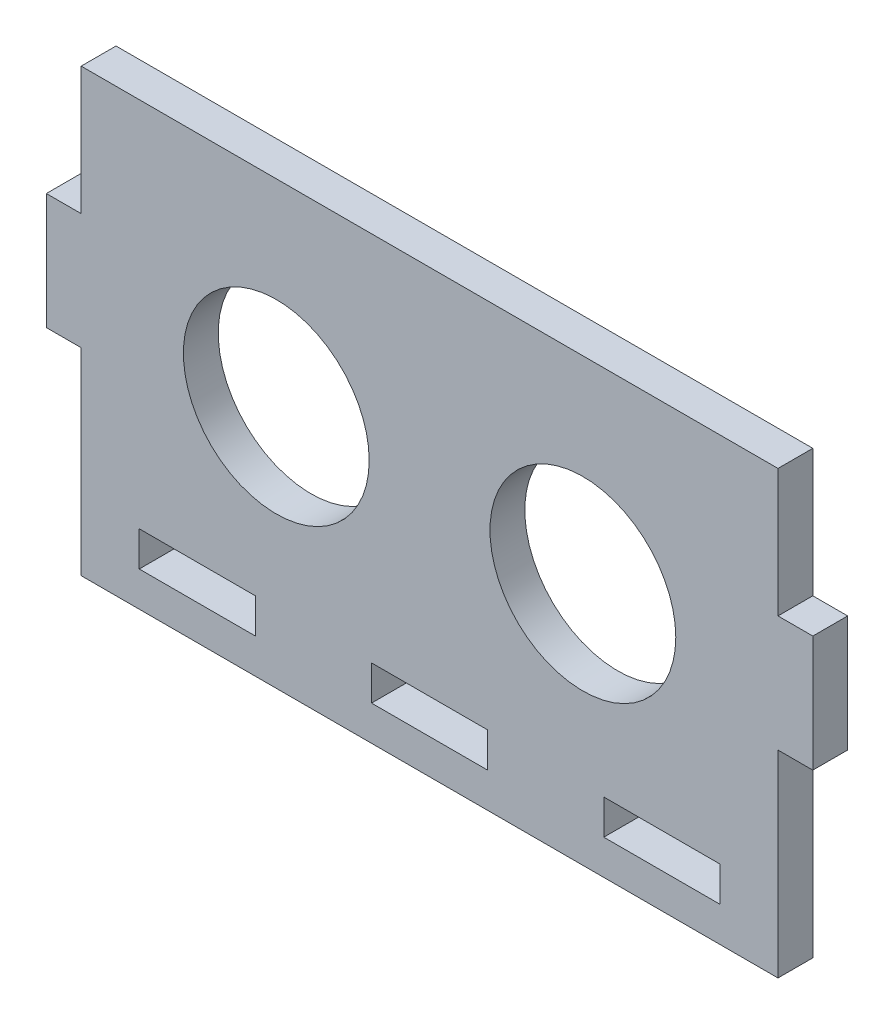
ISO-10303-21;
HEADER;
FILE_DESCRIPTION(('STEP AP214'),'2;1');
FILE_NAME('part.step','',(''),(''),'','','');
FILE_SCHEMA(('AUTOMOTIVE_DESIGN { 1 0 10303 214 1 1 1 1 }'));
ENDSEC;
DATA;
#1=APPLICATION_CONTEXT('core data for automotive mechanical design processes');
#2=APPLICATION_PROTOCOL_DEFINITION('international standard','automotive_design',2000,#1);
#3=PRODUCT_CONTEXT('',#1,'mechanical');
#4=PRODUCT('Part','Part','',(#3));
#5=PRODUCT_RELATED_PRODUCT_CATEGORY('part','',(#4));
#6=PRODUCT_DEFINITION_FORMATION('','',#4);
#7=PRODUCT_DEFINITION_CONTEXT('part definition',#1,'design');
#8=PRODUCT_DEFINITION('design','',#6,#7);
#9=PRODUCT_DEFINITION_SHAPE('','',#8);
#10=(LENGTH_UNIT() NAMED_UNIT(*) SI_UNIT(.MILLI.,.METRE.));
#11=(NAMED_UNIT(*) PLANE_ANGLE_UNIT() SI_UNIT($,.RADIAN.));
#12=(NAMED_UNIT(*) SI_UNIT($,.STERADIAN.) SOLID_ANGLE_UNIT());
#13=UNCERTAINTY_MEASURE_WITH_UNIT(LENGTH_MEASURE(1.E-05),#10,'distance_accuracy_value','');
#14=(GEOMETRIC_REPRESENTATION_CONTEXT(3) GLOBAL_UNCERTAINTY_ASSIGNED_CONTEXT((#13)) GLOBAL_UNIT_ASSIGNED_CONTEXT((#10,
#11,#12)) REPRESENTATION_CONTEXT('',''));
#15=CARTESIAN_POINT('',(0.,0.,0.));
#16=DIRECTION('',(0.,0.,1.));
#17=DIRECTION('',(1.,0.,0.));
#18=AXIS2_PLACEMENT_3D('',#15,#16,#17);
#19=CARTESIAN_POINT('',(-27.8506787330317,0.,3.));
#20=DIRECTION('',(1.,0.,0.));
#21=DIRECTION('',(0.,1.,0.));
#22=AXIS2_PLACEMENT_3D('',#19,#20,#21);
#23=PLANE('',#22);
#24=DIRECTION('',(0.,-1.,0.));
#25=VECTOR('',#24,1.);
#26=CARTESIAN_POINT('',(-27.8506787330317,0.,0.));
#27=LINE('',#26,#25);
#28=CARTESIAN_POINT('',(-27.8506787330317,-16.9321266968326,0.));
#29=VERTEX_POINT('',#28);
#30=CARTESIAN_POINT('',(-27.8506787330317,-19.9321266968326,0.));
#31=VERTEX_POINT('',#30);
#32=EDGE_CURVE('E345',#29,#31,#27,.T.);
#33=ORIENTED_EDGE('',*,*,#32,.F.);
#34=DIRECTION('',(0.,0.,-1.));
#35=VECTOR('',#34,1.);
#36=CARTESIAN_POINT('',(-27.8506787330317,-16.9321266968326,3.));
#37=LINE('',#36,#35);
#38=CARTESIAN_POINT('',(-27.8506787330317,-16.9321266968326,3.));
#39=VERTEX_POINT('',#38);
#40=EDGE_CURVE('E11',#39,#29,#37,.T.);
#41=ORIENTED_EDGE('',*,*,#40,.F.);
#42=DIRECTION('',(0.,-1.,0.));
#43=VECTOR('',#42,1.);
#44=CARTESIAN_POINT('',(-27.8506787330317,0.,3.));
#45=LINE('',#44,#43);
#46=CARTESIAN_POINT('',(-27.8506787330317,-19.9321266968326,3.));
#47=VERTEX_POINT('',#46);
#48=EDGE_CURVE('E216',#39,#47,#45,.T.);
#49=ORIENTED_EDGE('',*,*,#48,.T.);
#50=DIRECTION('',(0.,0.,-1.));
#51=VECTOR('',#50,1.);
#52=CARTESIAN_POINT('',(-27.8506787330317,-19.9321266968326,3.));
#53=LINE('',#52,#51);
#54=EDGE_CURVE('E54',#47,#31,#53,.T.);
#55=ORIENTED_EDGE('',*,*,#54,.T.);
#56=EDGE_LOOP('',(#33,#41,#49,#55));
#57=FACE_BOUND('',#56,.T.);
#58=ADVANCED_FACE('F35',(#57),#23,.T.);
#59=CARTESIAN_POINT('',(0.,-16.9321266968326,3.));
#60=DIRECTION('',(0.,1.,0.));
#61=DIRECTION('',(0.,0.,1.));
#62=AXIS2_PLACEMENT_3D('',#59,#60,#61);
#63=PLANE('',#62);
#64=DIRECTION('',(1.,0.,0.));
#65=VECTOR('',#64,1.);
#66=CARTESIAN_POINT('',(0.,-16.9321266968326,0.));
#67=LINE('',#66,#65);
#68=CARTESIAN_POINT('',(-17.8506787330317,-16.9321266968326,0.));
#69=VERTEX_POINT('',#68);
#70=EDGE_CURVE('E221',#29,#69,#67,.T.);
#71=ORIENTED_EDGE('',*,*,#70,.T.);
#72=DIRECTION('',(0.,0.,-1.));
#73=VECTOR('',#72,1.);
#74=CARTESIAN_POINT('',(-17.8506787330317,-16.9321266968326,3.));
#75=LINE('',#74,#73);
#76=CARTESIAN_POINT('',(-17.8506787330317,-16.9321266968326,3.));
#77=VERTEX_POINT('',#76);
#78=EDGE_CURVE('E45',#77,#69,#75,.T.);
#79=ORIENTED_EDGE('',*,*,#78,.F.);
#80=DIRECTION('',(1.,0.,0.));
#81=VECTOR('',#80,1.);
#82=CARTESIAN_POINT('',(0.,-16.9321266968326,3.));
#83=LINE('',#82,#81);
#84=EDGE_CURVE('E211',#39,#77,#83,.T.);
#85=ORIENTED_EDGE('',*,*,#84,.F.);
#86=ORIENTED_EDGE('',*,*,#40,.T.);
#87=EDGE_LOOP('',(#71,#79,#85,#86));
#88=FACE_BOUND('',#87,.T.);
#89=ADVANCED_FACE('F219',(#88),#63,.F.);
#90=CARTESIAN_POINT('',(-17.8506787330317,0.,3.));
#91=DIRECTION('',(1.,0.,0.));
#92=DIRECTION('',(0.,0.,-1.));
#93=AXIS2_PLACEMENT_3D('',#90,#91,#92);
#94=PLANE('',#93);
#95=DIRECTION('',(0.,-1.,0.));
#96=VECTOR('',#95,1.);
#97=CARTESIAN_POINT('',(-17.8506787330317,0.,0.));
#98=LINE('',#97,#96);
#99=CARTESIAN_POINT('',(-17.8506787330317,-19.9321266968326,0.));
#100=VERTEX_POINT('',#99);
#101=EDGE_CURVE('E348',#69,#100,#98,.T.);
#102=ORIENTED_EDGE('',*,*,#101,.T.);
#103=DIRECTION('',(0.,0.,-1.));
#104=VECTOR('',#103,1.);
#105=CARTESIAN_POINT('',(-17.8506787330317,-19.9321266968326,3.));
#106=LINE('',#105,#104);
#107=CARTESIAN_POINT('',(-17.8506787330317,-19.9321266968326,3.));
#108=VERTEX_POINT('',#107);
#109=EDGE_CURVE('E128',#108,#100,#106,.T.);
#110=ORIENTED_EDGE('',*,*,#109,.F.);
#111=DIRECTION('',(0.,-1.,0.));
#112=VECTOR('',#111,1.);
#113=CARTESIAN_POINT('',(-17.8506787330317,0.,3.));
#114=LINE('',#113,#112);
#115=EDGE_CURVE('E203',#77,#108,#114,.T.);
#116=ORIENTED_EDGE('',*,*,#115,.F.);
#117=ORIENTED_EDGE('',*,*,#78,.T.);
#118=EDGE_LOOP('',(#102,#110,#116,#117));
#119=FACE_BOUND('',#118,.T.);
#120=ADVANCED_FACE('F205',(#119),#94,.F.);
#121=CARTESIAN_POINT('',(27.1493212669683,0.,3.));
#122=DIRECTION('',(1.,0.,0.));
#123=DIRECTION('',(0.,0.,-1.));
#124=AXIS2_PLACEMENT_3D('',#121,#122,#123);
#125=PLANE('',#124);
#126=DIRECTION('',(0.,-1.,0.));
#127=VECTOR('',#126,1.);
#128=CARTESIAN_POINT('',(27.1493212669683,0.,0.));
#129=LINE('',#128,#127);
#130=CARTESIAN_POINT('',(27.1493212669683,15.0678733031674,0.));
#131=VERTEX_POINT('',#130);
#132=CARTESIAN_POINT('',(27.1493212669683,4.06787330316742,0.));
#133=VERTEX_POINT('',#132);
#134=EDGE_CURVE('E313',#131,#133,#129,.T.);
#135=ORIENTED_EDGE('',*,*,#134,.F.);
#136=DIRECTION('',(0.,0.,-1.));
#137=VECTOR('',#136,1.);
#138=CARTESIAN_POINT('',(27.1493212669683,15.0678733031674,3.));
#139=LINE('',#138,#137);
#140=CARTESIAN_POINT('',(27.1493212669683,15.0678733031674,3.));
#141=VERTEX_POINT('',#140);
#142=EDGE_CURVE('E254',#141,#131,#139,.T.);
#143=ORIENTED_EDGE('',*,*,#142,.F.);
#144=DIRECTION('',(0.,-1.,0.));
#145=VECTOR('',#144,1.);
#146=CARTESIAN_POINT('',(27.1493212669683,0.,3.));
#147=LINE('',#146,#145);
#148=CARTESIAN_POINT('',(27.1493212669683,4.06787330316742,3.));
#149=VERTEX_POINT('',#148);
#150=EDGE_CURVE('E381',#141,#149,#147,.T.);
#151=ORIENTED_EDGE('',*,*,#150,.T.);
#152=DIRECTION('',(0.,0.,-1.));
#153=VECTOR('',#152,1.);
#154=CARTESIAN_POINT('',(27.1493212669683,4.06787330316742,3.));
#155=LINE('',#154,#153);
#156=EDGE_CURVE('E226',#149,#133,#155,.T.);
#157=ORIENTED_EDGE('',*,*,#156,.T.);
#158=EDGE_LOOP('',(#135,#143,#151,#157));
#159=FACE_BOUND('',#158,.T.);
#160=ADVANCED_FACE('F456',(#159),#125,.T.);
#161=CARTESIAN_POINT('',(0.,15.0678733031674,3.));
#162=DIRECTION('',(0.,1.,0.));
#163=DIRECTION('',(0.,0.,1.));
#164=AXIS2_PLACEMENT_3D('',#161,#162,#163);
#165=PLANE('',#164);
#166=DIRECTION('',(1.,0.,0.));
#167=VECTOR('',#166,1.);
#168=CARTESIAN_POINT('',(0.,15.0678733031674,0.));
#169=LINE('',#168,#167);
#170=CARTESIAN_POINT('',(-32.8506787330317,15.0678733031674,0.));
#171=VERTEX_POINT('',#170);
#172=EDGE_CURVE('E316',#171,#131,#169,.T.);
#173=ORIENTED_EDGE('',*,*,#172,.F.);
#174=DIRECTION('',(0.,0.,-1.));
#175=VECTOR('',#174,1.);
#176=CARTESIAN_POINT('',(-32.8506787330317,15.0678733031674,3.));
#177=LINE('',#176,#175);
#178=CARTESIAN_POINT('',(-32.8506787330317,15.0678733031674,3.));
#179=VERTEX_POINT('',#178);
#180=EDGE_CURVE('E252',#179,#171,#177,.T.);
#181=ORIENTED_EDGE('',*,*,#180,.F.);
#182=DIRECTION('',(1.,0.,0.));
#183=VECTOR('',#182,1.);
#184=CARTESIAN_POINT('',(0.,15.0678733031674,3.));
#185=LINE('',#184,#183);
#186=EDGE_CURVE('E384',#179,#141,#185,.T.);
#187=ORIENTED_EDGE('',*,*,#186,.T.);
#188=ORIENTED_EDGE('',*,*,#142,.T.);
#189=EDGE_LOOP('',(#173,#181,#187,#188));
#190=FACE_BOUND('',#189,.T.);
#191=ADVANCED_FACE('F477',(#190),#165,.T.);
#192=CARTESIAN_POINT('',(-32.8506787330317,0.,3.));
#193=DIRECTION('',(1.,0.,0.));
#194=DIRECTION('',(0.,1.,0.));
#195=AXIS2_PLACEMENT_3D('',#192,#193,#194);
#196=PLANE('',#195);
#197=DIRECTION('',(0.,-1.,0.));
#198=VECTOR('',#197,1.);
#199=CARTESIAN_POINT('',(-32.8506787330317,0.,0.));
#200=LINE('',#199,#198);
#201=CARTESIAN_POINT('',(-32.8506787330317,4.06787330316742,0.));
#202=VERTEX_POINT('',#201);
#203=EDGE_CURVE('E320',#171,#202,#200,.T.);
#204=ORIENTED_EDGE('',*,*,#203,.T.);
#205=DIRECTION('',(0.,0.,-1.));
#206=VECTOR('',#205,1.);
#207=CARTESIAN_POINT('',(-32.8506787330317,4.06787330316742,3.));
#208=LINE('',#207,#206);
#209=CARTESIAN_POINT('',(-32.8506787330317,4.06787330316742,3.));
#210=VERTEX_POINT('',#209);
#211=EDGE_CURVE('E249',#210,#202,#208,.T.);
#212=ORIENTED_EDGE('',*,*,#211,.F.);
#213=DIRECTION('',(0.,-1.,0.));
#214=VECTOR('',#213,1.);
#215=CARTESIAN_POINT('',(-32.8506787330317,0.,3.));
#216=LINE('',#215,#214);
#217=EDGE_CURVE('E388',#179,#210,#216,.T.);
#218=ORIENTED_EDGE('',*,*,#217,.F.);
#219=ORIENTED_EDGE('',*,*,#180,.T.);
#220=EDGE_LOOP('',(#204,#212,#218,#219));
#221=FACE_BOUND('',#220,.T.);
#222=ADVANCED_FACE('F465',(#221),#196,.F.);
#223=CARTESIAN_POINT('',(0.,4.06787330316742,3.));
#224=DIRECTION('',(0.,-1.,0.));
#225=DIRECTION('',(0.,0.,-1.));
#226=AXIS2_PLACEMENT_3D('',#223,#224,#225);
#227=PLANE('',#226);
#228=DIRECTION('',(-1.,0.,0.));
#229=VECTOR('',#228,1.);
#230=CARTESIAN_POINT('',(0.,4.06787330316742,0.));
#231=LINE('',#230,#229);
#232=CARTESIAN_POINT('',(-35.8506787330317,4.06787330316742,0.));
#233=VERTEX_POINT('',#232);
#234=EDGE_CURVE('E323',#202,#233,#231,.T.);
#235=ORIENTED_EDGE('',*,*,#234,.T.);
#236=DIRECTION('',(0.,0.,-1.));
#237=VECTOR('',#236,1.);
#238=CARTESIAN_POINT('',(-35.8506787330317,4.06787330316742,3.));
#239=LINE('',#238,#237);
#240=CARTESIAN_POINT('',(-35.8506787330317,4.06787330316742,3.));
#241=VERTEX_POINT('',#240);
#242=EDGE_CURVE('E246',#241,#233,#239,.T.);
#243=ORIENTED_EDGE('',*,*,#242,.F.);
#244=DIRECTION('',(-1.,0.,0.));
#245=VECTOR('',#244,1.);
#246=CARTESIAN_POINT('',(0.,4.06787330316742,3.));
#247=LINE('',#246,#245);
#248=EDGE_CURVE('E391',#210,#241,#247,.T.);
#249=ORIENTED_EDGE('',*,*,#248,.F.);
#250=ORIENTED_EDGE('',*,*,#211,.T.);
#251=EDGE_LOOP('',(#235,#243,#249,#250));
#252=FACE_BOUND('',#251,.T.);
#253=ADVANCED_FACE('F472',(#252),#227,.F.);
#254=CARTESIAN_POINT('',(-35.8506787330317,0.,3.));
#255=DIRECTION('',(1.,0.,0.));
#256=DIRECTION('',(0.,0.,-1.));
#257=AXIS2_PLACEMENT_3D('',#254,#255,#256);
#258=PLANE('',#257);
#259=DIRECTION('',(0.,-1.,0.));
#260=VECTOR('',#259,1.);
#261=CARTESIAN_POINT('',(-35.8506787330317,0.,0.));
#262=LINE('',#261,#260);
#263=CARTESIAN_POINT('',(-35.8506787330317,-5.93212669683258,0.));
#264=VERTEX_POINT('',#263);
#265=EDGE_CURVE('E327',#233,#264,#262,.T.);
#266=ORIENTED_EDGE('',*,*,#265,.T.);
#267=DIRECTION('',(0.,0.,-1.));
#268=VECTOR('',#267,1.);
#269=CARTESIAN_POINT('',(-35.8506787330317,-5.93212669683258,3.));
#270=LINE('',#269,#268);
#271=CARTESIAN_POINT('',(-35.8506787330317,-5.93212669683258,3.));
#272=VERTEX_POINT('',#271);
#273=EDGE_CURVE('E243',#272,#264,#270,.T.);
#274=ORIENTED_EDGE('',*,*,#273,.F.);
#275=DIRECTION('',(0.,-1.,0.));
#276=VECTOR('',#275,1.);
#277=CARTESIAN_POINT('',(-35.8506787330317,0.,3.));
#278=LINE('',#277,#276);
#279=EDGE_CURVE('E395',#241,#272,#278,.T.);
#280=ORIENTED_EDGE('',*,*,#279,.F.);
#281=ORIENTED_EDGE('',*,*,#242,.T.);
#282=EDGE_LOOP('',(#266,#274,#280,#281));
#283=FACE_BOUND('',#282,.T.);
#284=ADVANCED_FACE('F468',(#283),#258,.F.);
#285=CARTESIAN_POINT('',(0.,-5.93212669683258,3.));
#286=DIRECTION('',(0.,1.,0.));
#287=DIRECTION('',(0.,0.,1.));
#288=AXIS2_PLACEMENT_3D('',#285,#286,#287);
#289=PLANE('',#288);
#290=DIRECTION('',(1.,0.,0.));
#291=VECTOR('',#290,1.);
#292=CARTESIAN_POINT('',(0.,-5.93212669683258,0.));
#293=LINE('',#292,#291);
#294=CARTESIAN_POINT('',(-32.8506787330317,-5.93212669683258,0.));
#295=VERTEX_POINT('',#294);
#296=EDGE_CURVE('E330',#264,#295,#293,.T.);
#297=ORIENTED_EDGE('',*,*,#296,.T.);
#298=DIRECTION('',(0.,0.,-1.));
#299=VECTOR('',#298,1.);
#300=CARTESIAN_POINT('',(-32.8506787330317,-5.93212669683258,3.));
#301=LINE('',#300,#299);
#302=CARTESIAN_POINT('',(-32.8506787330317,-5.93212669683258,3.));
#303=VERTEX_POINT('',#302);
#304=EDGE_CURVE('E240',#303,#295,#301,.T.);
#305=ORIENTED_EDGE('',*,*,#304,.F.);
#306=DIRECTION('',(1.,0.,0.));
#307=VECTOR('',#306,1.);
#308=CARTESIAN_POINT('',(0.,-5.93212669683258,3.));
#309=LINE('',#308,#307);
#310=EDGE_CURVE('E398',#272,#303,#309,.T.);
#311=ORIENTED_EDGE('',*,*,#310,.F.);
#312=ORIENTED_EDGE('',*,*,#273,.T.);
#313=EDGE_LOOP('',(#297,#305,#311,#312));
#314=FACE_BOUND('',#313,.T.);
#315=ADVANCED_FACE('F463',(#314),#289,.F.);
#316=CARTESIAN_POINT('',(-32.8506787330317,-22.9321266968326,0.));
#317=VERTEX_POINT('',#316);
#318=EDGE_CURVE('E324',#295,#317,#200,.T.);
#319=ORIENTED_EDGE('',*,*,#318,.T.);
#320=DIRECTION('',(0.,0.,-1.));
#321=VECTOR('',#320,1.);
#322=CARTESIAN_POINT('',(-32.8506787330317,-22.9321266968326,3.));
#323=LINE('',#322,#321);
#324=CARTESIAN_POINT('',(-32.8506787330317,-22.9321266968326,3.));
#325=VERTEX_POINT('',#324);
#326=EDGE_CURVE('E237',#325,#317,#323,.T.);
#327=ORIENTED_EDGE('',*,*,#326,.F.);
#328=EDGE_CURVE('E392',#303,#325,#216,.T.);
#329=ORIENTED_EDGE('',*,*,#328,.F.);
#330=ORIENTED_EDGE('',*,*,#304,.T.);
#331=EDGE_LOOP('',(#319,#327,#329,#330));
#332=FACE_BOUND('',#331,.T.);
#333=ADVANCED_FACE('F459',(#332),#196,.F.);
#334=CARTESIAN_POINT('',(0.,-22.9321266968326,3.));
#335=DIRECTION('',(0.,1.,0.));
#336=DIRECTION('',(0.,0.,1.));
#337=AXIS2_PLACEMENT_3D('',#334,#335,#336);
#338=PLANE('',#337);
#339=DIRECTION('',(1.,0.,0.));
#340=VECTOR('',#339,1.);
#341=CARTESIAN_POINT('',(0.,-22.9321266968326,0.));
#342=LINE('',#341,#340);
#343=CARTESIAN_POINT('',(27.1493212669683,-22.9321266968326,0.));
#344=VERTEX_POINT('',#343);
#345=EDGE_CURVE('E333',#317,#344,#342,.T.);
#346=ORIENTED_EDGE('',*,*,#345,.T.);
#347=DIRECTION('',(0.,0.,-1.));
#348=VECTOR('',#347,1.);
#349=CARTESIAN_POINT('',(27.1493212669683,-22.9321266968326,3.));
#350=LINE('',#349,#348);
#351=CARTESIAN_POINT('',(27.1493212669683,-22.9321266968326,3.));
#352=VERTEX_POINT('',#351);
#353=EDGE_CURVE('E235',#352,#344,#350,.T.);
#354=ORIENTED_EDGE('',*,*,#353,.F.);
#355=DIRECTION('',(1.,0.,0.));
#356=VECTOR('',#355,1.);
#357=CARTESIAN_POINT('',(0.,-22.9321266968326,3.));
#358=LINE('',#357,#356);
#359=EDGE_CURVE('E401',#325,#352,#358,.T.);
#360=ORIENTED_EDGE('',*,*,#359,.F.);
#361=ORIENTED_EDGE('',*,*,#326,.T.);
#362=EDGE_LOOP('',(#346,#354,#360,#361));
#363=FACE_BOUND('',#362,.T.);
#364=ADVANCED_FACE('F454',(#363),#338,.F.);
#365=CARTESIAN_POINT('',(27.1493212669683,-5.93212669683258,0.));
#366=VERTEX_POINT('',#365);
#367=EDGE_CURVE('E317',#366,#344,#129,.T.);
#368=ORIENTED_EDGE('',*,*,#367,.F.);
#369=DIRECTION('',(0.,0.,-1.));
#370=VECTOR('',#369,1.);
#371=CARTESIAN_POINT('',(27.1493212669683,-5.93212669683258,3.));
#372=LINE('',#371,#370);
#373=CARTESIAN_POINT('',(27.1493212669683,-5.93212669683258,3.));
#374=VERTEX_POINT('',#373);
#375=EDGE_CURVE('E233',#374,#366,#372,.T.);
#376=ORIENTED_EDGE('',*,*,#375,.F.);
#377=EDGE_CURVE('E385',#374,#352,#147,.T.);
#378=ORIENTED_EDGE('',*,*,#377,.T.);
#379=ORIENTED_EDGE('',*,*,#353,.T.);
#380=EDGE_LOOP('',(#368,#376,#378,#379));
#381=FACE_BOUND('',#380,.T.);
#382=ADVANCED_FACE('F450',(#381),#125,.T.);
#383=CARTESIAN_POINT('',(0.,-5.93212669683258,3.));
#384=DIRECTION('',(0.,-1.,0.));
#385=DIRECTION('',(0.,0.,-1.));
#386=AXIS2_PLACEMENT_3D('',#383,#384,#385);
#387=PLANE('',#386);
#388=DIRECTION('',(-1.,0.,0.));
#389=VECTOR('',#388,1.);
#390=CARTESIAN_POINT('',(0.,-5.93212669683258,0.));
#391=LINE('',#390,#389);
#392=CARTESIAN_POINT('',(30.1493212669683,-5.93212669683258,0.));
#393=VERTEX_POINT('',#392);
#394=EDGE_CURVE('E336',#393,#366,#391,.T.);
#395=ORIENTED_EDGE('',*,*,#394,.F.);
#396=DIRECTION('',(0.,0.,-1.));
#397=VECTOR('',#396,1.);
#398=CARTESIAN_POINT('',(30.1493212669683,-5.93212669683258,3.));
#399=LINE('',#398,#397);
#400=CARTESIAN_POINT('',(30.1493212669683,-5.93212669683258,3.));
#401=VERTEX_POINT('',#400);
#402=EDGE_CURVE('E231',#401,#393,#399,.T.);
#403=ORIENTED_EDGE('',*,*,#402,.F.);
#404=DIRECTION('',(-1.,0.,0.));
#405=VECTOR('',#404,1.);
#406=CARTESIAN_POINT('',(0.,-5.93212669683258,3.));
#407=LINE('',#406,#405);
#408=EDGE_CURVE('E403',#401,#374,#407,.T.);
#409=ORIENTED_EDGE('',*,*,#408,.T.);
#410=ORIENTED_EDGE('',*,*,#375,.T.);
#411=EDGE_LOOP('',(#395,#403,#409,#410));
#412=FACE_BOUND('',#411,.T.);
#413=ADVANCED_FACE('F446',(#412),#387,.T.);
#414=CARTESIAN_POINT('',(30.1493212669683,0.,3.));
#415=DIRECTION('',(1.,0.,0.));
#416=DIRECTION('',(0.,0.,-1.));
#417=AXIS2_PLACEMENT_3D('',#414,#415,#416);
#418=PLANE('',#417);
#419=DIRECTION('',(0.,-1.,0.));
#420=VECTOR('',#419,1.);
#421=CARTESIAN_POINT('',(30.1493212669683,0.,0.));
#422=LINE('',#421,#420);
#423=CARTESIAN_POINT('',(30.1493212669683,4.06787330316742,0.));
#424=VERTEX_POINT('',#423);
#425=EDGE_CURVE('E339',#424,#393,#422,.T.);
#426=ORIENTED_EDGE('',*,*,#425,.F.);
#427=DIRECTION('',(0.,0.,-1.));
#428=VECTOR('',#427,1.);
#429=CARTESIAN_POINT('',(30.1493212669683,4.06787330316742,3.));
#430=LINE('',#429,#428);
#431=CARTESIAN_POINT('',(30.1493212669683,4.06787330316742,3.));
#432=VERTEX_POINT('',#431);
#433=EDGE_CURVE('E228',#432,#424,#430,.T.);
#434=ORIENTED_EDGE('',*,*,#433,.F.);
#435=DIRECTION('',(0.,-1.,0.));
#436=VECTOR('',#435,1.);
#437=CARTESIAN_POINT('',(30.1493212669683,0.,3.));
#438=LINE('',#437,#436);
#439=EDGE_CURVE('E406',#432,#401,#438,.T.);
#440=ORIENTED_EDGE('',*,*,#439,.T.);
#441=ORIENTED_EDGE('',*,*,#402,.T.);
#442=EDGE_LOOP('',(#426,#434,#440,#441));
#443=FACE_BOUND('',#442,.T.);
#444=ADVANCED_FACE('F442',(#443),#418,.T.);
#445=CARTESIAN_POINT('',(12.1493212669683,0.,3.));
#446=DIRECTION('',(1.,0.,0.));
#447=DIRECTION('',(0.,0.,-1.));
#448=AXIS2_PLACEMENT_3D('',#445,#446,#447);
#449=PLANE('',#448);
#450=DIRECTION('',(0.,-1.,0.));
#451=VECTOR('',#450,1.);
#452=CARTESIAN_POINT('',(12.1493212669683,0.,0.));
#453=LINE('',#452,#451);
#454=CARTESIAN_POINT('',(12.1493212669683,-16.9321266968326,0.));
#455=VERTEX_POINT('',#454);
#456=CARTESIAN_POINT('',(12.1493212669683,-19.9321266968326,0.));
#457=VERTEX_POINT('',#456);
#458=EDGE_CURVE('E301',#455,#457,#453,.T.);
#459=ORIENTED_EDGE('',*,*,#458,.F.);
#460=DIRECTION('',(0.,0.,-1.));
#461=VECTOR('',#460,1.);
#462=CARTESIAN_POINT('',(12.1493212669683,-16.9321266968326,3.));
#463=LINE('',#462,#461);
#464=CARTESIAN_POINT('',(12.1493212669683,-16.9321266968326,3.));
#465=VERTEX_POINT('',#464);
#466=EDGE_CURVE('E229',#465,#455,#463,.T.);
#467=ORIENTED_EDGE('',*,*,#466,.F.);
#468=DIRECTION('',(0.,-1.,0.));
#469=VECTOR('',#468,1.);
#470=CARTESIAN_POINT('',(12.1493212669683,0.,3.));
#471=LINE('',#470,#469);
#472=CARTESIAN_POINT('',(12.1493212669683,-19.9321266968326,3.));
#473=VERTEX_POINT('',#472);
#474=EDGE_CURVE('E370',#465,#473,#471,.T.);
#475=ORIENTED_EDGE('',*,*,#474,.T.);
#476=DIRECTION('',(0.,0.,-1.));
#477=VECTOR('',#476,1.);
#478=CARTESIAN_POINT('',(12.1493212669683,-19.9321266968326,3.));
#479=LINE('',#478,#477);
#480=EDGE_CURVE('E256',#473,#457,#479,.T.);
#481=ORIENTED_EDGE('',*,*,#480,.T.);
#482=EDGE_LOOP('',(#459,#467,#475,#481));
#483=FACE_BOUND('',#482,.T.);
#484=ADVANCED_FACE('F445',(#483),#449,.T.);
#485=CARTESIAN_POINT('',(0.,-16.9321266968326,3.));
#486=DIRECTION('',(0.,-1.,0.));
#487=DIRECTION('',(0.,0.,-1.));
#488=AXIS2_PLACEMENT_3D('',#485,#486,#487);
#489=PLANE('',#488);
#490=DIRECTION('',(-1.,0.,0.));
#491=VECTOR('',#490,1.);
#492=CARTESIAN_POINT('',(0.,-16.9321266968326,0.));
#493=LINE('',#492,#491);
#494=CARTESIAN_POINT('',(22.1493212669683,-16.9321266968326,0.));
#495=VERTEX_POINT('',#494);
#496=EDGE_CURVE('E304',#495,#455,#493,.T.);
#497=ORIENTED_EDGE('',*,*,#496,.F.);
#498=DIRECTION('',(0.,0.,-1.));
#499=VECTOR('',#498,1.);
#500=CARTESIAN_POINT('',(22.1493212669683,-16.9321266968326,3.));
#501=LINE('',#500,#499);
#502=CARTESIAN_POINT('',(22.1493212669683,-16.9321266968326,3.));
#503=VERTEX_POINT('',#502);
#504=EDGE_CURVE('E261',#503,#495,#501,.T.);
#505=ORIENTED_EDGE('',*,*,#504,.F.);
#506=DIRECTION('',(-1.,0.,0.));
#507=VECTOR('',#506,1.);
#508=CARTESIAN_POINT('',(0.,-16.9321266968326,3.));
#509=LINE('',#508,#507);
#510=EDGE_CURVE('E373',#503,#465,#509,.T.);
#511=ORIENTED_EDGE('',*,*,#510,.T.);
#512=ORIENTED_EDGE('',*,*,#466,.T.);
#513=EDGE_LOOP('',(#497,#505,#511,#512));
#514=FACE_BOUND('',#513,.T.);
#515=ADVANCED_FACE('F487',(#514),#489,.T.);
#516=CARTESIAN_POINT('',(22.1493212669683,0.,3.));
#517=DIRECTION('',(1.,0.,0.));
#518=DIRECTION('',(0.,1.,0.));
#519=AXIS2_PLACEMENT_3D('',#516,#517,#518);
#520=PLANE('',#519);
#521=DIRECTION('',(0.,-1.,0.));
#522=VECTOR('',#521,1.);
#523=CARTESIAN_POINT('',(22.1493212669683,0.,0.));
#524=LINE('',#523,#522);
#525=CARTESIAN_POINT('',(22.1493212669683,-19.9321266968326,0.));
#526=VERTEX_POINT('',#525);
#527=EDGE_CURVE('E307',#495,#526,#524,.T.);
#528=ORIENTED_EDGE('',*,*,#527,.T.);
#529=DIRECTION('',(0.,0.,-1.));
#530=VECTOR('',#529,1.);
#531=CARTESIAN_POINT('',(22.1493212669683,-19.9321266968326,3.));
#532=LINE('',#531,#530);
#533=CARTESIAN_POINT('',(22.1493212669683,-19.9321266968326,3.));
#534=VERTEX_POINT('',#533);
#535=EDGE_CURVE('E258',#534,#526,#532,.T.);
#536=ORIENTED_EDGE('',*,*,#535,.F.);
#537=DIRECTION('',(0.,-1.,0.));
#538=VECTOR('',#537,1.);
#539=CARTESIAN_POINT('',(22.1493212669683,0.,3.));
#540=LINE('',#539,#538);
#541=EDGE_CURVE('E376',#503,#534,#540,.T.);
#542=ORIENTED_EDGE('',*,*,#541,.F.);
#543=ORIENTED_EDGE('',*,*,#504,.T.);
#544=EDGE_LOOP('',(#528,#536,#542,#543));
#545=FACE_BOUND('',#544,.T.);
#546=ADVANCED_FACE('F484',(#545),#520,.F.);
#547=CARTESIAN_POINT('',(-7.85067873303169,0.,3.));
#548=DIRECTION('',(1.,0.,0.));
#549=DIRECTION('',(0.,0.,-1.));
#550=AXIS2_PLACEMENT_3D('',#547,#548,#549);
#551=PLANE('',#550);
#552=DIRECTION('',(0.,-1.,0.));
#553=VECTOR('',#552,1.);
#554=CARTESIAN_POINT('',(-7.85067873303169,0.,0.));
#555=LINE('',#554,#553);
#556=CARTESIAN_POINT('',(-7.85067873303169,-16.9321266968326,0.));
#557=VERTEX_POINT('',#556);
#558=CARTESIAN_POINT('',(-7.85067873303169,-19.9321266968326,0.));
#559=VERTEX_POINT('',#558);
#560=EDGE_CURVE('E285',#557,#559,#555,.T.);
#561=ORIENTED_EDGE('',*,*,#560,.F.);
#562=DIRECTION('',(0.,0.,-1.));
#563=VECTOR('',#562,1.);
#564=CARTESIAN_POINT('',(-7.85067873303169,-16.9321266968326,3.));
#565=LINE('',#564,#563);
#566=CARTESIAN_POINT('',(-7.85067873303169,-16.9321266968326,3.));
#567=VERTEX_POINT('',#566);
#568=EDGE_CURVE('E39',#567,#557,#565,.T.);
#569=ORIENTED_EDGE('',*,*,#568,.F.);
#570=DIRECTION('',(0.,-1.,0.));
#571=VECTOR('',#570,1.);
#572=CARTESIAN_POINT('',(-7.85067873303169,0.,3.));
#573=LINE('',#572,#571);
#574=CARTESIAN_POINT('',(-7.85067873303169,-19.9321266968326,3.));
#575=VERTEX_POINT('',#574);
#576=EDGE_CURVE('E360',#567,#575,#573,.T.);
#577=ORIENTED_EDGE('',*,*,#576,.T.);
#578=DIRECTION('',(0.,0.,-1.));
#579=VECTOR('',#578,1.);
#580=CARTESIAN_POINT('',(-7.85067873303169,-19.9321266968326,3.));
#581=LINE('',#580,#579);
#582=EDGE_CURVE('E264',#575,#559,#581,.T.);
#583=ORIENTED_EDGE('',*,*,#582,.T.);
#584=EDGE_LOOP('',(#561,#569,#577,#583));
#585=FACE_BOUND('',#584,.T.);
#586=ADVANCED_FACE('F288',(#585),#551,.T.);
#587=CARTESIAN_POINT('',(0.,-16.9321266968326,3.));
#588=DIRECTION('',(0.,1.,0.));
#589=DIRECTION('',(0.,0.,1.));
#590=AXIS2_PLACEMENT_3D('',#587,#588,#589);
#591=PLANE('',#590);
#592=DIRECTION('',(1.,0.,0.));
#593=VECTOR('',#592,1.);
#594=CARTESIAN_POINT('',(0.,-16.9321266968326,0.));
#595=LINE('',#594,#593);
#596=CARTESIAN_POINT('',(2.14932126696831,-16.9321266968326,0.));
#597=VERTEX_POINT('',#596);
#598=EDGE_CURVE('E277',#557,#597,#595,.T.);
#599=ORIENTED_EDGE('',*,*,#598,.T.);
#600=DIRECTION('',(0.,0.,-1.));
#601=VECTOR('',#600,1.);
#602=CARTESIAN_POINT('',(2.14932126696831,-16.9321266968326,3.));
#603=LINE('',#602,#601);
#604=CARTESIAN_POINT('',(2.14932126696831,-16.9321266968326,3.));
#605=VERTEX_POINT('',#604);
#606=EDGE_CURVE('E268',#605,#597,#603,.T.);
#607=ORIENTED_EDGE('',*,*,#606,.F.);
#608=DIRECTION('',(1.,0.,0.));
#609=VECTOR('',#608,1.);
#610=CARTESIAN_POINT('',(0.,-16.9321266968326,3.));
#611=LINE('',#610,#609);
#612=EDGE_CURVE('E279',#567,#605,#611,.T.);
#613=ORIENTED_EDGE('',*,*,#612,.F.);
#614=ORIENTED_EDGE('',*,*,#568,.T.);
#615=EDGE_LOOP('',(#599,#607,#613,#614));
#616=FACE_BOUND('',#615,.T.);
#617=ADVANCED_FACE('F276',(#616),#591,.F.);
#618=CARTESIAN_POINT('',(2.1493212669683,0.,3.));
#619=DIRECTION('',(1.,0.,0.));
#620=DIRECTION('',(0.,1.,0.));
#621=AXIS2_PLACEMENT_3D('',#618,#619,#620);
#622=PLANE('',#621);
#623=DIRECTION('',(0.,-1.,0.));
#624=VECTOR('',#623,1.);
#625=CARTESIAN_POINT('',(2.1493212669683,0.,0.));
#626=LINE('',#625,#624);
#627=CARTESIAN_POINT('',(2.14932126696831,-19.9321266968326,0.));
#628=VERTEX_POINT('',#627);
#629=EDGE_CURVE('E286',#597,#628,#626,.T.);
#630=ORIENTED_EDGE('',*,*,#629,.T.);
#631=DIRECTION('',(0.,0.,-1.));
#632=VECTOR('',#631,1.);
#633=CARTESIAN_POINT('',(2.14932126696831,-19.9321266968326,3.));
#634=LINE('',#633,#632);
#635=CARTESIAN_POINT('',(2.14932126696831,-19.9321266968326,3.));
#636=VERTEX_POINT('',#635);
#637=EDGE_CURVE('E266',#636,#628,#634,.T.);
#638=ORIENTED_EDGE('',*,*,#637,.F.);
#639=DIRECTION('',(0.,-1.,0.));
#640=VECTOR('',#639,1.);
#641=CARTESIAN_POINT('',(2.1493212669683,0.,3.));
#642=LINE('',#641,#640);
#643=EDGE_CURVE('E365',#605,#636,#642,.T.);
#644=ORIENTED_EDGE('',*,*,#643,.F.);
#645=ORIENTED_EDGE('',*,*,#606,.T.);
#646=EDGE_LOOP('',(#630,#638,#644,#645));
#647=FACE_BOUND('',#646,.T.);
#648=ADVANCED_FACE('F440',(#647),#622,.F.);
#649=CARTESIAN_POINT('',(0.,4.06787330316742,3.));
#650=DIRECTION('',(0.,1.,0.));
#651=DIRECTION('',(0.,0.,1.));
#652=AXIS2_PLACEMENT_3D('',#649,#650,#651);
#653=PLANE('',#652);
#654=DIRECTION('',(1.,0.,0.));
#655=VECTOR('',#654,1.);
#656=CARTESIAN_POINT('',(0.,4.06787330316742,0.));
#657=LINE('',#656,#655);
#658=EDGE_CURVE('E342',#133,#424,#657,.T.);
#659=ORIENTED_EDGE('',*,*,#658,.F.);
#660=ORIENTED_EDGE('',*,*,#156,.F.);
#661=DIRECTION('',(1.,0.,0.));
#662=VECTOR('',#661,1.);
#663=CARTESIAN_POINT('',(0.,4.06787330316742,3.));
#664=LINE('',#663,#662);
#665=EDGE_CURVE('E409',#149,#432,#664,.T.);
#666=ORIENTED_EDGE('',*,*,#665,.T.);
#667=ORIENTED_EDGE('',*,*,#433,.T.);
#668=EDGE_LOOP('',(#659,#660,#666,#667));
#669=FACE_BOUND('',#668,.T.);
#670=ADVANCED_FACE('F436',(#669),#653,.T.);
#671=CARTESIAN_POINT('',(0.,-19.9321266968326,3.));
#672=DIRECTION('',(0.,-1.,0.));
#673=DIRECTION('',(0.,0.,-1.));
#674=AXIS2_PLACEMENT_3D('',#671,#672,#673);
#675=PLANE('',#674);
#676=DIRECTION('',(-1.,0.,0.));
#677=VECTOR('',#676,1.);
#678=CARTESIAN_POINT('',(0.,-19.9321266968326,0.));
#679=LINE('',#678,#677);
#680=EDGE_CURVE('E310',#526,#457,#679,.T.);
#681=ORIENTED_EDGE('',*,*,#680,.T.);
#682=ORIENTED_EDGE('',*,*,#480,.F.);
#683=DIRECTION('',(-1.,0.,0.));
#684=VECTOR('',#683,1.);
#685=CARTESIAN_POINT('',(0.,-19.9321266968326,3.));
#686=LINE('',#685,#684);
#687=EDGE_CURVE('E379',#534,#473,#686,.T.);
#688=ORIENTED_EDGE('',*,*,#687,.F.);
#689=ORIENTED_EDGE('',*,*,#535,.T.);
#690=EDGE_LOOP('',(#681,#682,#688,#689));
#691=FACE_BOUND('',#690,.T.);
#692=ADVANCED_FACE('F439',(#691),#675,.F.);
#693=CARTESIAN_POINT('',(0.,-19.9321266968326,3.));
#694=DIRECTION('',(0.,-1.,0.));
#695=DIRECTION('',(0.,0.,-1.));
#696=AXIS2_PLACEMENT_3D('',#693,#694,#695);
#697=PLANE('',#696);
#698=DIRECTION('',(-1.,0.,0.));
#699=VECTOR('',#698,1.);
#700=CARTESIAN_POINT('',(0.,-19.9321266968326,0.));
#701=LINE('',#700,#699);
#702=EDGE_CURVE('E299',#628,#559,#701,.T.);
#703=ORIENTED_EDGE('',*,*,#702,.T.);
#704=ORIENTED_EDGE('',*,*,#582,.F.);
#705=DIRECTION('',(-1.,0.,0.));
#706=VECTOR('',#705,1.);
#707=CARTESIAN_POINT('',(0.,-19.9321266968326,3.));
#708=LINE('',#707,#706);
#709=EDGE_CURVE('E368',#636,#575,#708,.T.);
#710=ORIENTED_EDGE('',*,*,#709,.F.);
#711=ORIENTED_EDGE('',*,*,#637,.T.);
#712=EDGE_LOOP('',(#703,#704,#710,#711));
#713=FACE_BOUND('',#712,.T.);
#714=ADVANCED_FACE('F426',(#713),#697,.F.);
#715=CARTESIAN_POINT('',(10.3493212669683,-1.93212669683258,3.));
#716=DIRECTION('',(0.,0.,-1.));
#717=DIRECTION('',(-1.,0.,0.));
#718=AXIS2_PLACEMENT_3D('',#715,#716,#717);
#719=CYLINDRICAL_SURFACE('',#718,8.);
#720=CARTESIAN_POINT('',(10.3493212669683,-1.93212669683258,3.));
#721=DIRECTION('',(0.,0.,1.));
#722=DIRECTION('',(1.,0.,0.));
#723=AXIS2_PLACEMENT_3D('',#720,#721,#722);
#724=CIRCLE('',#723,8.);
#725=CARTESIAN_POINT('',(18.3493212669683,-1.93212669683258,3.));
#726=VERTEX_POINT('',#725);
#727=EDGE_CURVE('E355',#726,#726,#724,.T.);
#728=ORIENTED_EDGE('',*,*,#727,.T.);
#729=EDGE_LOOP('',(#728));
#730=FACE_BOUND('',#729,.T.);
#731=CARTESIAN_POINT('',(10.3493212669683,-1.93212669683258,0.));
#732=DIRECTION('',(0.,0.,1.));
#733=DIRECTION('',(1.,0.,0.));
#734=AXIS2_PLACEMENT_3D('',#731,#732,#733);
#735=CIRCLE('',#734,8.);
#736=CARTESIAN_POINT('',(18.3493212669683,-1.93212669683258,0.));
#737=VERTEX_POINT('',#736);
#738=EDGE_CURVE('E291',#737,#737,#735,.T.);
#739=ORIENTED_EDGE('',*,*,#738,.F.);
#740=EDGE_LOOP('',(#739));
#741=FACE_BOUND('',#740,.T.);
#742=ADVANCED_FACE('F420',(#730,#741),#719,.F.);
#743=CARTESIAN_POINT('',(-16.0506787330317,-1.93212669683258,3.));
#744=DIRECTION('',(0.,0.,-1.));
#745=DIRECTION('',(-1.,0.,0.));
#746=AXIS2_PLACEMENT_3D('',#743,#744,#745);
#747=CYLINDRICAL_SURFACE('',#746,8.);
#748=CARTESIAN_POINT('',(-16.0506787330317,-1.93212669683258,3.));
#749=DIRECTION('',(0.,0.,1.));
#750=DIRECTION('',(1.,0.,0.));
#751=AXIS2_PLACEMENT_3D('',#748,#749,#750);
#752=CIRCLE('',#751,8.);
#753=CARTESIAN_POINT('',(-8.0506787330317,-1.93212669683258,3.));
#754=VERTEX_POINT('',#753);
#755=EDGE_CURVE('E352',#754,#754,#752,.T.);
#756=ORIENTED_EDGE('',*,*,#755,.T.);
#757=EDGE_LOOP('',(#756));
#758=FACE_BOUND('',#757,.T.);
#759=CARTESIAN_POINT('',(-16.0506787330317,-1.93212669683258,0.));
#760=DIRECTION('',(0.,0.,1.));
#761=DIRECTION('',(1.,0.,0.));
#762=AXIS2_PLACEMENT_3D('',#759,#760,#761);
#763=CIRCLE('',#762,8.);
#764=CARTESIAN_POINT('',(-8.0506787330317,-1.93212669683258,0.));
#765=VERTEX_POINT('',#764);
#766=EDGE_CURVE('E294',#765,#765,#763,.T.);
#767=ORIENTED_EDGE('',*,*,#766,.F.);
#768=EDGE_LOOP('',(#767));
#769=FACE_BOUND('',#768,.T.);
#770=ADVANCED_FACE('F37',(#758,#769),#747,.F.);
#771=CARTESIAN_POINT('',(0.,-19.9321266968326,3.));
#772=DIRECTION('',(0.,1.,0.));
#773=DIRECTION('',(0.,0.,1.));
#774=AXIS2_PLACEMENT_3D('',#771,#772,#773);
#775=PLANE('',#774);
#776=DIRECTION('',(1.,0.,0.));
#777=VECTOR('',#776,1.);
#778=CARTESIAN_POINT('',(0.,-19.9321266968326,0.));
#779=LINE('',#778,#777);
#780=EDGE_CURVE('E350',#31,#100,#779,.T.);
#781=ORIENTED_EDGE('',*,*,#780,.F.);
#782=ORIENTED_EDGE('',*,*,#54,.F.);
#783=DIRECTION('',(1.,0.,0.));
#784=VECTOR('',#783,1.);
#785=CARTESIAN_POINT('',(0.,-19.9321266968326,3.));
#786=LINE('',#785,#784);
#787=EDGE_CURVE('E210',#47,#108,#786,.T.);
#788=ORIENTED_EDGE('',*,*,#787,.T.);
#789=ORIENTED_EDGE('',*,*,#109,.T.);
#790=EDGE_LOOP('',(#781,#782,#788,#789));
#791=FACE_BOUND('',#790,.T.);
#792=ADVANCED_FACE('F419',(#791),#775,.T.);
#793=CARTESIAN_POINT('',(0.,0.,3.));
#794=DIRECTION('',(0.,0.,1.));
#795=DIRECTION('',(1.,0.,0.));
#796=AXIS2_PLACEMENT_3D('',#793,#794,#795);
#797=PLANE('',#796);
#798=ORIENTED_EDGE('',*,*,#755,.F.);
#799=EDGE_LOOP('',(#798));
#800=FACE_BOUND('',#799,.T.);
#801=ORIENTED_EDGE('',*,*,#727,.F.);
#802=EDGE_LOOP('',(#801));
#803=FACE_BOUND('',#802,.T.);
#804=ORIENTED_EDGE('',*,*,#576,.F.);
#805=ORIENTED_EDGE('',*,*,#612,.T.);
#806=ORIENTED_EDGE('',*,*,#643,.T.);
#807=ORIENTED_EDGE('',*,*,#709,.T.);
#808=EDGE_LOOP('',(#804,#805,#806,#807));
#809=FACE_BOUND('',#808,.T.);
#810=ORIENTED_EDGE('',*,*,#474,.F.);
#811=ORIENTED_EDGE('',*,*,#510,.F.);
#812=ORIENTED_EDGE('',*,*,#541,.T.);
#813=ORIENTED_EDGE('',*,*,#687,.T.);
#814=EDGE_LOOP('',(#810,#811,#812,#813));
#815=FACE_BOUND('',#814,.T.);
#816=ORIENTED_EDGE('',*,*,#150,.F.);
#817=ORIENTED_EDGE('',*,*,#186,.F.);
#818=ORIENTED_EDGE('',*,*,#217,.T.);
#819=ORIENTED_EDGE('',*,*,#248,.T.);
#820=ORIENTED_EDGE('',*,*,#279,.T.);
#821=ORIENTED_EDGE('',*,*,#310,.T.);
#822=ORIENTED_EDGE('',*,*,#328,.T.);
#823=ORIENTED_EDGE('',*,*,#359,.T.);
#824=ORIENTED_EDGE('',*,*,#377,.F.);
#825=ORIENTED_EDGE('',*,*,#408,.F.);
#826=ORIENTED_EDGE('',*,*,#439,.F.);
#827=ORIENTED_EDGE('',*,*,#665,.F.);
#828=EDGE_LOOP('',(#816,#817,#818,#819,#820,#821,#822,#823,#824,#825,#826,#827));
#829=FACE_BOUND('',#828,.T.);
#830=ORIENTED_EDGE('',*,*,#48,.F.);
#831=ORIENTED_EDGE('',*,*,#84,.T.);
#832=ORIENTED_EDGE('',*,*,#115,.T.);
#833=ORIENTED_EDGE('',*,*,#787,.F.);
#834=EDGE_LOOP('',(#830,#831,#832,#833));
#835=FACE_BOUND('',#834,.T.);
#836=ADVANCED_FACE('F215',(#800,#803,#809,#815,#829,#835),#797,.T.);
#837=CARTESIAN_POINT('',(0.,0.,0.));
#838=DIRECTION('',(0.,0.,1.));
#839=DIRECTION('',(1.,0.,0.));
#840=AXIS2_PLACEMENT_3D('',#837,#838,#839);
#841=PLANE('',#840);
#842=ORIENTED_EDGE('',*,*,#766,.T.);
#843=EDGE_LOOP('',(#842));
#844=FACE_BOUND('',#843,.T.);
#845=ORIENTED_EDGE('',*,*,#738,.T.);
#846=EDGE_LOOP('',(#845));
#847=FACE_BOUND('',#846,.T.);
#848=ORIENTED_EDGE('',*,*,#560,.T.);
#849=ORIENTED_EDGE('',*,*,#702,.F.);
#850=ORIENTED_EDGE('',*,*,#629,.F.);
#851=ORIENTED_EDGE('',*,*,#598,.F.);
#852=EDGE_LOOP('',(#848,#849,#850,#851));
#853=FACE_BOUND('',#852,.T.);
#854=ORIENTED_EDGE('',*,*,#458,.T.);
#855=ORIENTED_EDGE('',*,*,#680,.F.);
#856=ORIENTED_EDGE('',*,*,#527,.F.);
#857=ORIENTED_EDGE('',*,*,#496,.T.);
#858=EDGE_LOOP('',(#854,#855,#856,#857));
#859=FACE_BOUND('',#858,.T.);
#860=ORIENTED_EDGE('',*,*,#134,.T.);
#861=ORIENTED_EDGE('',*,*,#658,.T.);
#862=ORIENTED_EDGE('',*,*,#425,.T.);
#863=ORIENTED_EDGE('',*,*,#394,.T.);
#864=ORIENTED_EDGE('',*,*,#367,.T.);
#865=ORIENTED_EDGE('',*,*,#345,.F.);
#866=ORIENTED_EDGE('',*,*,#318,.F.);
#867=ORIENTED_EDGE('',*,*,#296,.F.);
#868=ORIENTED_EDGE('',*,*,#265,.F.);
#869=ORIENTED_EDGE('',*,*,#234,.F.);
#870=ORIENTED_EDGE('',*,*,#203,.F.);
#871=ORIENTED_EDGE('',*,*,#172,.T.);
#872=EDGE_LOOP('',(#860,#861,#862,#863,#864,#865,#866,#867,#868,#869,#870,#871));
#873=FACE_BOUND('',#872,.T.);
#874=ORIENTED_EDGE('',*,*,#32,.T.);
#875=ORIENTED_EDGE('',*,*,#780,.T.);
#876=ORIENTED_EDGE('',*,*,#101,.F.);
#877=ORIENTED_EDGE('',*,*,#70,.F.);
#878=EDGE_LOOP('',(#874,#875,#876,#877));
#879=FACE_BOUND('',#878,.T.);
#880=ADVANCED_FACE('F283',(#844,#847,#853,#859,#873,#879),#841,.F.);
#881=CLOSED_SHELL('',(#58,#89,#120,#160,#191,#222,#253,#284,#315,#333,#364,#382,#413,#444,#484,
#515,#546,#586,#617,#648,#670,#692,#714,#742,#770,#792,#836,#880));
#882=MANIFOLD_SOLID_BREP('B2',#881);
#883=ADVANCED_BREP_SHAPE_REPRESENTATION('',(#18,#882),#14);
#884=SHAPE_DEFINITION_REPRESENTATION(#9,#883);
ENDSEC;
END-ISO-10303-21;
